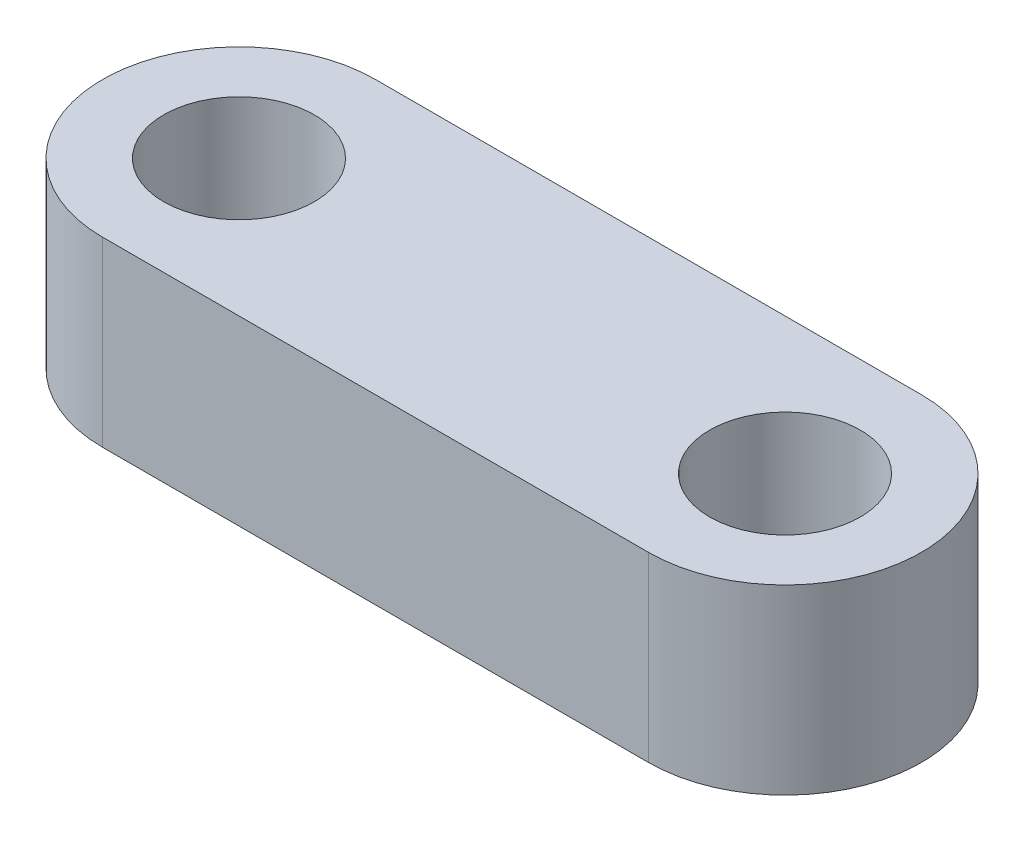
ISO-10303-21;
HEADER;
FILE_DESCRIPTION(('STEP AP214'),'2;1');
FILE_NAME('part.step','',(''),(''),'','','');
FILE_SCHEMA(('AUTOMOTIVE_DESIGN { 1 0 10303 214 1 1 1 1 }'));
ENDSEC;
DATA;
#1=APPLICATION_CONTEXT('core data for automotive mechanical design processes');
#2=APPLICATION_PROTOCOL_DEFINITION('international standard','automotive_design',2000,#1);
#3=PRODUCT_CONTEXT('',#1,'mechanical');
#4=PRODUCT('Part','Part','',(#3));
#5=PRODUCT_RELATED_PRODUCT_CATEGORY('part','',(#4));
#6=PRODUCT_DEFINITION_FORMATION('','',#4);
#7=PRODUCT_DEFINITION_CONTEXT('part definition',#1,'design');
#8=PRODUCT_DEFINITION('design','',#6,#7);
#9=PRODUCT_DEFINITION_SHAPE('','',#8);
#10=(LENGTH_UNIT() NAMED_UNIT(*) SI_UNIT(.MILLI.,.METRE.));
#11=(NAMED_UNIT(*) PLANE_ANGLE_UNIT() SI_UNIT($,.RADIAN.));
#12=(NAMED_UNIT(*) SI_UNIT($,.STERADIAN.) SOLID_ANGLE_UNIT());
#13=UNCERTAINTY_MEASURE_WITH_UNIT(LENGTH_MEASURE(1.E-05),#10,'distance_accuracy_value','');
#14=(GEOMETRIC_REPRESENTATION_CONTEXT(3) GLOBAL_UNCERTAINTY_ASSIGNED_CONTEXT((#13)) GLOBAL_UNIT_ASSIGNED_CONTEXT((#10,
#11,#12)) REPRESENTATION_CONTEXT('',''));
#15=CARTESIAN_POINT('',(0.,0.,0.));
#16=DIRECTION('',(0.,0.,1.));
#17=DIRECTION('',(1.,0.,0.));
#18=AXIS2_PLACEMENT_3D('',#15,#16,#17);
#19=CARTESIAN_POINT('',(0.,6.35,0.));
#20=DIRECTION('',(0.,1.,0.));
#21=DIRECTION('',(0.,0.,1.));
#22=AXIS2_PLACEMENT_3D('',#19,#20,#21);
#23=PLANE('',#22);
#24=CARTESIAN_POINT('',(0.,6.35,0.));
#25=DIRECTION('',(0.,1.,0.));
#26=DIRECTION('',(0.,0.,1.));
#27=AXIS2_PLACEMENT_3D('',#24,#25,#26);
#28=CIRCLE('',#27,2.6289);
#29=CARTESIAN_POINT('',(0.,6.35,2.6289));
#30=VERTEX_POINT('',#29);
#31=EDGE_CURVE('E112',#30,#30,#28,.T.);
#32=ORIENTED_EDGE('',*,*,#31,.F.);
#33=EDGE_LOOP('',(#32));
#34=FACE_BOUND('',#33,.T.);
#35=CARTESIAN_POINT('',(0.,6.35,0.));
#36=DIRECTION('',(0.,1.,0.));
#37=DIRECTION('',(0.,0.,1.));
#38=AXIS2_PLACEMENT_3D('',#35,#36,#37);
#39=CIRCLE('',#38,4.7625);
#40=CARTESIAN_POINT('',(0.,6.35,-4.7625));
#41=VERTEX_POINT('',#40);
#42=CARTESIAN_POINT('',(0.,6.35,4.7625));
#43=VERTEX_POINT('',#42);
#44=EDGE_CURVE('E92',#41,#43,#39,.T.);
#45=ORIENTED_EDGE('',*,*,#44,.T.);
#46=DIRECTION('',(1.,0.,0.));
#47=VECTOR('',#46,1.);
#48=CARTESIAN_POINT('',(0.,6.35,4.7625));
#49=LINE('',#48,#47);
#50=CARTESIAN_POINT('',(19.05,6.35,4.7625));
#51=VERTEX_POINT('',#50);
#52=EDGE_CURVE('E87',#43,#51,#49,.T.);
#53=ORIENTED_EDGE('',*,*,#52,.T.);
#54=CARTESIAN_POINT('',(19.05,6.35,0.));
#55=DIRECTION('',(0.,1.,0.));
#56=DIRECTION('',(0.,0.,-1.));
#57=AXIS2_PLACEMENT_3D('',#54,#55,#56);
#58=CIRCLE('',#57,4.7625);
#59=CARTESIAN_POINT('',(19.05,6.35,-4.7625));
#60=VERTEX_POINT('',#59);
#61=EDGE_CURVE('E90',#51,#60,#58,.T.);
#62=ORIENTED_EDGE('',*,*,#61,.T.);
#63=DIRECTION('',(-1.,0.,0.));
#64=VECTOR('',#63,1.);
#65=CARTESIAN_POINT('',(0.,6.35,-4.7625));
#66=LINE('',#65,#64);
#67=EDGE_CURVE('E57',#60,#41,#66,.T.);
#68=ORIENTED_EDGE('',*,*,#67,.T.);
#69=EDGE_LOOP('',(#45,#53,#62,#68));
#70=FACE_BOUND('',#69,.T.);
#71=CARTESIAN_POINT('',(19.05,6.35,0.));
#72=DIRECTION('',(0.,1.,0.));
#73=DIRECTION('',(0.,0.,1.));
#74=AXIS2_PLACEMENT_3D('',#71,#72,#73);
#75=CIRCLE('',#74,2.6289);
#76=CARTESIAN_POINT('',(19.05,6.35,2.6289));
#77=VERTEX_POINT('',#76);
#78=EDGE_CURVE('E134',#77,#77,#75,.T.);
#79=ORIENTED_EDGE('',*,*,#78,.F.);
#80=EDGE_LOOP('',(#79));
#81=FACE_BOUND('',#80,.T.);
#82=ADVANCED_FACE('F39',(#34,#70,#81),#23,.T.);
#83=CARTESIAN_POINT('',(0.,0.,0.));
#84=DIRECTION('',(0.,1.,0.));
#85=DIRECTION('',(0.,0.,1.));
#86=AXIS2_PLACEMENT_3D('',#83,#84,#85);
#87=PLANE('',#86);
#88=CARTESIAN_POINT('',(0.,0.,0.));
#89=DIRECTION('',(0.,1.,0.));
#90=DIRECTION('',(0.,0.,1.));
#91=AXIS2_PLACEMENT_3D('',#88,#89,#90);
#92=CIRCLE('',#91,4.7625);
#93=CARTESIAN_POINT('',(0.,0.,-4.7625));
#94=VERTEX_POINT('',#93);
#95=CARTESIAN_POINT('',(0.,0.,4.7625));
#96=VERTEX_POINT('',#95);
#97=EDGE_CURVE('E108',#94,#96,#92,.T.);
#98=ORIENTED_EDGE('',*,*,#97,.F.);
#99=DIRECTION('',(-1.,0.,0.));
#100=VECTOR('',#99,1.);
#101=CARTESIAN_POINT('',(0.,0.,-4.7625));
#102=LINE('',#101,#100);
#103=CARTESIAN_POINT('',(19.05,0.,-4.7625));
#104=VERTEX_POINT('',#103);
#105=EDGE_CURVE('E80',#104,#94,#102,.T.);
#106=ORIENTED_EDGE('',*,*,#105,.F.);
#107=CARTESIAN_POINT('',(19.05,0.,0.));
#108=DIRECTION('',(0.,1.,0.));
#109=DIRECTION('',(0.,0.,-1.));
#110=AXIS2_PLACEMENT_3D('',#107,#108,#109);
#111=CIRCLE('',#110,4.7625);
#112=CARTESIAN_POINT('',(19.05,0.,4.7625));
#113=VERTEX_POINT('',#112);
#114=EDGE_CURVE('E74',#113,#104,#111,.T.);
#115=ORIENTED_EDGE('',*,*,#114,.F.);
#116=DIRECTION('',(1.,0.,0.));
#117=VECTOR('',#116,1.);
#118=CARTESIAN_POINT('',(0.,0.,4.7625));
#119=LINE('',#118,#117);
#120=EDGE_CURVE('E97',#96,#113,#119,.T.);
#121=ORIENTED_EDGE('',*,*,#120,.F.);
#122=EDGE_LOOP('',(#98,#106,#115,#121));
#123=FACE_BOUND('',#122,.T.);
#124=CARTESIAN_POINT('',(0.,0.,0.));
#125=DIRECTION('',(0.,1.,0.));
#126=DIRECTION('',(0.,0.,1.));
#127=AXIS2_PLACEMENT_3D('',#124,#125,#126);
#128=CIRCLE('',#127,2.6289);
#129=CARTESIAN_POINT('',(0.,0.,2.6289));
#130=VERTEX_POINT('',#129);
#131=EDGE_CURVE('E130',#130,#130,#128,.T.);
#132=ORIENTED_EDGE('',*,*,#131,.T.);
#133=EDGE_LOOP('',(#132));
#134=FACE_BOUND('',#133,.T.);
#135=CARTESIAN_POINT('',(19.05,0.,0.));
#136=DIRECTION('',(0.,1.,0.));
#137=DIRECTION('',(0.,0.,1.));
#138=AXIS2_PLACEMENT_3D('',#135,#136,#137);
#139=CIRCLE('',#138,2.6289);
#140=CARTESIAN_POINT('',(19.05,0.,2.6289));
#141=VERTEX_POINT('',#140);
#142=EDGE_CURVE('E138',#141,#141,#139,.T.);
#143=ORIENTED_EDGE('',*,*,#142,.T.);
#144=EDGE_LOOP('',(#143));
#145=FACE_BOUND('',#144,.T.);
#146=ADVANCED_FACE('F125',(#123,#134,#145),#87,.F.);
#147=CARTESIAN_POINT('',(0.,6.35,0.));
#148=DIRECTION('',(0.,-1.,0.));
#149=DIRECTION('',(0.,0.,-1.));
#150=AXIS2_PLACEMENT_3D('',#147,#148,#149);
#151=CYLINDRICAL_SURFACE('',#150,4.7625);
#152=ORIENTED_EDGE('',*,*,#97,.T.);
#153=DIRECTION('',(0.,-1.,0.));
#154=VECTOR('',#153,1.);
#155=CARTESIAN_POINT('',(0.,6.35,4.7625));
#156=LINE('',#155,#154);
#157=EDGE_CURVE('E11',#43,#96,#156,.T.);
#158=ORIENTED_EDGE('',*,*,#157,.F.);
#159=ORIENTED_EDGE('',*,*,#44,.F.);
#160=DIRECTION('',(0.,-1.,0.));
#161=VECTOR('',#160,1.);
#162=CARTESIAN_POINT('',(0.,6.35,-4.7625));
#163=LINE('',#162,#161);
#164=EDGE_CURVE('E104',#41,#94,#163,.T.);
#165=ORIENTED_EDGE('',*,*,#164,.T.);
#166=EDGE_LOOP('',(#152,#158,#159,#165));
#167=FACE_BOUND('',#166,.T.);
#168=ADVANCED_FACE('F41',(#167),#151,.T.);
#169=CARTESIAN_POINT('',(0.,6.35,4.7625));
#170=DIRECTION('',(0.,0.,-1.));
#171=DIRECTION('',(-1.,0.,0.));
#172=AXIS2_PLACEMENT_3D('',#169,#170,#171);
#173=PLANE('',#172);
#174=ORIENTED_EDGE('',*,*,#120,.T.);
#175=DIRECTION('',(0.,-1.,0.));
#176=VECTOR('',#175,1.);
#177=CARTESIAN_POINT('',(19.05,6.35,4.7625));
#178=LINE('',#177,#176);
#179=EDGE_CURVE('E49',#51,#113,#178,.T.);
#180=ORIENTED_EDGE('',*,*,#179,.F.);
#181=ORIENTED_EDGE('',*,*,#52,.F.);
#182=ORIENTED_EDGE('',*,*,#157,.T.);
#183=EDGE_LOOP('',(#174,#180,#181,#182));
#184=FACE_BOUND('',#183,.T.);
#185=ADVANCED_FACE('F96',(#184),#173,.F.);
#186=CARTESIAN_POINT('',(19.05,6.35,0.));
#187=DIRECTION('',(0.,-1.,0.));
#188=DIRECTION('',(0.,0.,-1.));
#189=AXIS2_PLACEMENT_3D('',#186,#187,#188);
#190=CYLINDRICAL_SURFACE('',#189,4.7625);
#191=ORIENTED_EDGE('',*,*,#114,.T.);
#192=DIRECTION('',(0.,-1.,0.));
#193=VECTOR('',#192,1.);
#194=CARTESIAN_POINT('',(19.05,6.35,-4.7625));
#195=LINE('',#194,#193);
#196=EDGE_CURVE('E99',#60,#104,#195,.T.);
#197=ORIENTED_EDGE('',*,*,#196,.F.);
#198=ORIENTED_EDGE('',*,*,#61,.F.);
#199=ORIENTED_EDGE('',*,*,#179,.T.);
#200=EDGE_LOOP('',(#191,#197,#198,#199));
#201=FACE_BOUND('',#200,.T.);
#202=ADVANCED_FACE('F100',(#201),#190,.T.);
#203=CARTESIAN_POINT('',(0.,6.35,-4.7625));
#204=DIRECTION('',(0.,0.,1.));
#205=DIRECTION('',(1.,0.,0.));
#206=AXIS2_PLACEMENT_3D('',#203,#204,#205);
#207=PLANE('',#206);
#208=ORIENTED_EDGE('',*,*,#105,.T.);
#209=ORIENTED_EDGE('',*,*,#164,.F.);
#210=ORIENTED_EDGE('',*,*,#67,.F.);
#211=ORIENTED_EDGE('',*,*,#196,.T.);
#212=EDGE_LOOP('',(#208,#209,#210,#211));
#213=FACE_BOUND('',#212,.T.);
#214=ADVANCED_FACE('F122',(#213),#207,.F.);
#215=CARTESIAN_POINT('',(0.,6.35,0.));
#216=DIRECTION('',(0.,-1.,0.));
#217=DIRECTION('',(0.,0.,-1.));
#218=AXIS2_PLACEMENT_3D('',#215,#216,#217);
#219=CYLINDRICAL_SURFACE('',#218,2.6289);
#220=ORIENTED_EDGE('',*,*,#31,.T.);
#221=EDGE_LOOP('',(#220));
#222=FACE_BOUND('',#221,.T.);
#223=ORIENTED_EDGE('',*,*,#131,.F.);
#224=EDGE_LOOP('',(#223));
#225=FACE_BOUND('',#224,.T.);
#226=ADVANCED_FACE('F157',(#222,#225),#219,.F.);
#227=CARTESIAN_POINT('',(19.05,6.35,0.));
#228=DIRECTION('',(0.,-1.,0.));
#229=DIRECTION('',(0.,0.,-1.));
#230=AXIS2_PLACEMENT_3D('',#227,#228,#229);
#231=CYLINDRICAL_SURFACE('',#230,2.6289);
#232=ORIENTED_EDGE('',*,*,#78,.T.);
#233=EDGE_LOOP('',(#232));
#234=FACE_BOUND('',#233,.T.);
#235=ORIENTED_EDGE('',*,*,#142,.F.);
#236=EDGE_LOOP('',(#235));
#237=FACE_BOUND('',#236,.T.);
#238=ADVANCED_FACE('F146',(#234,#237),#231,.F.);
#239=CLOSED_SHELL('',(#82,#146,#168,#185,#202,#214,#226,#238));
#240=MANIFOLD_SOLID_BREP('B2',#239);
#241=ADVANCED_BREP_SHAPE_REPRESENTATION('',(#18,#240),#14);
#242=SHAPE_DEFINITION_REPRESENTATION(#9,#241);
ENDSEC;
END-ISO-10303-21;
